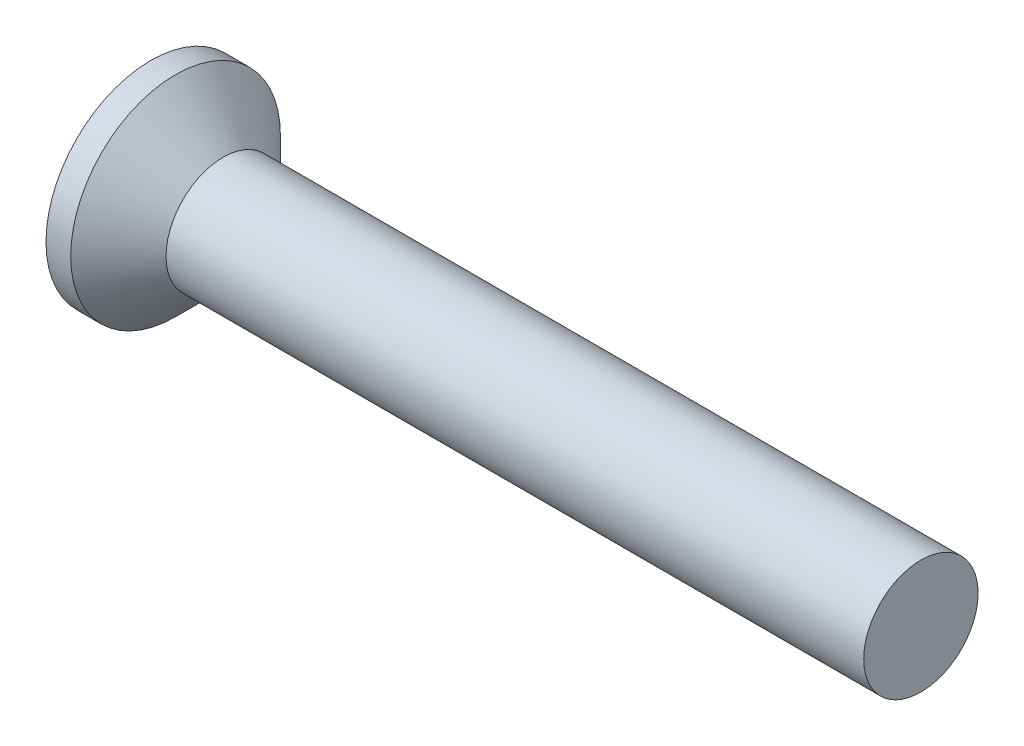
ISO-10303-21;
HEADER;
FILE_DESCRIPTION(('STEP AP214'),'2;1');
FILE_NAME('part.step','',(''),(''),'','','');
FILE_SCHEMA(('AUTOMOTIVE_DESIGN { 1 0 10303 214 1 1 1 1 }'));
ENDSEC;
DATA;
#1=APPLICATION_CONTEXT('core data for automotive mechanical design processes');
#2=APPLICATION_PROTOCOL_DEFINITION('international standard','automotive_design',2000,#1);
#3=PRODUCT_CONTEXT('',#1,'mechanical');
#4=PRODUCT('Part','Part','',(#3));
#5=PRODUCT_RELATED_PRODUCT_CATEGORY('part','',(#4));
#6=PRODUCT_DEFINITION_FORMATION('','',#4);
#7=PRODUCT_DEFINITION_CONTEXT('part definition',#1,'design');
#8=PRODUCT_DEFINITION('design','',#6,#7);
#9=PRODUCT_DEFINITION_SHAPE('','',#8);
#10=(LENGTH_UNIT() NAMED_UNIT(*) SI_UNIT(.MILLI.,.METRE.));
#11=(NAMED_UNIT(*) PLANE_ANGLE_UNIT() SI_UNIT($,.RADIAN.));
#12=(NAMED_UNIT(*) SI_UNIT($,.STERADIAN.) SOLID_ANGLE_UNIT());
#13=UNCERTAINTY_MEASURE_WITH_UNIT(LENGTH_MEASURE(1.E-05),#10,'distance_accuracy_value','');
#14=(GEOMETRIC_REPRESENTATION_CONTEXT(3) GLOBAL_UNCERTAINTY_ASSIGNED_CONTEXT((#13)) GLOBAL_UNIT_ASSIGNED_CONTEXT((#10,
#11,#12)) REPRESENTATION_CONTEXT('',''));
#15=CARTESIAN_POINT('',(0.,0.,0.));
#16=DIRECTION('',(0.,0.,1.));
#17=DIRECTION('',(1.,0.,0.));
#18=AXIS2_PLACEMENT_3D('',#15,#16,#17);
#19=CARTESIAN_POINT('',(7.4,0.,0.));
#20=DIRECTION('',(-1.,0.,0.));
#21=DIRECTION('',(0.,-1.,0.));
#22=AXIS2_PLACEMENT_3D('',#19,#20,#21);
#23=SPHERICAL_SURFACE('',#22,7.4);
#24=CARTESIAN_POINT('',(0.529956332016513,0.,0.));
#25=DIRECTION('',(-1.,0.,0.));
#26=DIRECTION('',(0.,0.,1.));
#27=AXIS2_PLACEMENT_3D('',#24,#25,#26);
#28=CIRCLE('',#27,2.75);
#29=CARTESIAN_POINT('',(0.529956332016513,0.,2.75));
#30=VERTEX_POINT('',#29);
#31=EDGE_CURVE('E159',#30,#30,#28,.T.);
#32=ORIENTED_EDGE('',*,*,#31,.T.);
#33=EDGE_LOOP('',(#32));
#34=FACE_BOUND('',#33,.T.);
#35=CARTESIAN_POINT('',(7.37844022875731,0.,-0.24209285299019));
#36=DIRECTION('',(-0.0887047329662643,0.,-0.996057965356125));
#37=DIRECTION('',(-0.996057965356125,0.,0.0887047329662643));
#38=AXIS2_PLACEMENT_3D('',#35,#36,#37);
#39=CIRCLE('',#38,7.39600745178066);
#40=CARTESIAN_POINT('',(0.185890101969758,1.59933099603895,0.398445409373938));
#41=VERTEX_POINT('',#40);
#42=CARTESIAN_POINT('',(0.0230796751196933,0.41294462120715,0.412944621207152));
#43=VERTEX_POINT('',#42);
#44=EDGE_CURVE('E127',#41,#43,#39,.F.);
#45=ORIENTED_EDGE('',*,*,#44,.T.);
#46=CARTESIAN_POINT('',(7.37844022875731,-0.24209285299019,0.));
#47=DIRECTION('',(-0.0887047329662644,-0.996057965356125,0.));
#48=DIRECTION('',(0.996057965356125,-0.0887047329662644,0.));
#49=AXIS2_PLACEMENT_3D('',#46,#47,#48);
#50=CIRCLE('',#49,7.39600745178066);
#51=CARTESIAN_POINT('',(0.185890101969758,0.398445409373932,1.59933099603895));
#52=VERTEX_POINT('',#51);
#53=EDGE_CURVE('E109',#43,#52,#50,.F.);
#54=ORIENTED_EDGE('',*,*,#53,.T.);
#55=CARTESIAN_POINT('',(5.99170841267437,0.,-2.16946737088841));
#56=DIRECTION('',(0.544482116778557,0.,0.838772450971264));
#57=DIRECTION('',(0.838772450971265,0.,-0.544482116778557));
#58=AXIS2_PLACEMENT_3D('',#55,#56,#57);
#59=CIRCLE('',#58,6.93326230080172);
#60=CARTESIAN_POINT('',(0.185890101969758,-0.398445409373944,1.59933099603894));
#61=VERTEX_POINT('',#60);
#62=EDGE_CURVE('E120',#61,#52,#59,.F.);
#63=ORIENTED_EDGE('',*,*,#62,.F.);
#64=CARTESIAN_POINT('',(7.37844022875731,0.24209285299019,0.));
#65=DIRECTION('',(-0.0887047329662643,0.996057965356125,0.));
#66=DIRECTION('',(-0.996057965356125,-0.0887047329662643,0.));
#67=AXIS2_PLACEMENT_3D('',#64,#65,#66);
#68=CIRCLE('',#67,7.39600745178066);
#69=CARTESIAN_POINT('',(0.0230796751196933,-0.412944621207153,0.412944621207152));
#70=VERTEX_POINT('',#69);
#71=EDGE_CURVE('E189',#61,#70,#68,.F.);
#72=ORIENTED_EDGE('',*,*,#71,.T.);
#73=CARTESIAN_POINT('',(0.185890101969758,-1.59933099603894,0.398445409373938));
#74=VERTEX_POINT('',#73);
#75=EDGE_CURVE('E164',#70,#74,#39,.F.);
#76=ORIENTED_EDGE('',*,*,#75,.T.);
#77=CARTESIAN_POINT('',(5.99170841267437,2.16946737088841,0.));
#78=DIRECTION('',(0.544482116778557,-0.838772450971264,0.));
#79=DIRECTION('',(0.838772450971264,0.544482116778557,0.));
#80=AXIS2_PLACEMENT_3D('',#77,#78,#79);
#81=CIRCLE('',#80,6.93326230080172);
#82=CARTESIAN_POINT('',(0.185890101969758,-1.59933099603895,-0.398445409373938));
#83=VERTEX_POINT('',#82);
#84=EDGE_CURVE('E162',#83,#74,#81,.F.);
#85=ORIENTED_EDGE('',*,*,#84,.F.);
#86=CARTESIAN_POINT('',(7.37844022875731,0.,0.24209285299019));
#87=DIRECTION('',(-0.0887047329662644,0.,0.996057965356125));
#88=DIRECTION('',(0.996057965356125,0.,0.0887047329662644));
#89=AXIS2_PLACEMENT_3D('',#86,#87,#88);
#90=CIRCLE('',#89,7.39600745178066);
#91=CARTESIAN_POINT('',(0.0230796751196933,-0.41294462120715,-0.412944621207152));
#92=VERTEX_POINT('',#91);
#93=EDGE_CURVE('E166',#83,#92,#90,.F.);
#94=ORIENTED_EDGE('',*,*,#93,.T.);
#95=CARTESIAN_POINT('',(0.185890101969758,-0.398445409373932,-1.59933099603895));
#96=VERTEX_POINT('',#95);
#97=EDGE_CURVE('E193',#92,#96,#68,.F.);
#98=ORIENTED_EDGE('',*,*,#97,.T.);
#99=CARTESIAN_POINT('',(5.99170841267437,0.,2.16946737088841));
#100=DIRECTION('',(0.544482116778557,0.,-0.838772450971264));
#101=DIRECTION('',(-0.838772450971264,0.,-0.544482116778557));
#102=AXIS2_PLACEMENT_3D('',#99,#100,#101);
#103=CIRCLE('',#102,6.93326230080172);
#104=CARTESIAN_POINT('',(0.185890101969758,0.398445409373943,-1.59933099603894));
#105=VERTEX_POINT('',#104);
#106=EDGE_CURVE('E121',#105,#96,#103,.F.);
#107=ORIENTED_EDGE('',*,*,#106,.F.);
#108=CARTESIAN_POINT('',(0.0230796751196933,0.412944621207153,-0.412944621207152));
#109=VERTEX_POINT('',#108);
#110=EDGE_CURVE('E146',#105,#109,#50,.F.);
#111=ORIENTED_EDGE('',*,*,#110,.T.);
#112=CARTESIAN_POINT('',(0.185890101969758,1.59933099603895,-0.398445409373938));
#113=VERTEX_POINT('',#112);
#114=EDGE_CURVE('E60',#109,#113,#90,.F.);
#115=ORIENTED_EDGE('',*,*,#114,.T.);
#116=CARTESIAN_POINT('',(5.99170841267437,-2.1694673708884,0.));
#117=DIRECTION('',(0.544482116778557,0.838772450971264,0.));
#118=DIRECTION('',(-0.838772450971265,0.544482116778557,0.));
#119=AXIS2_PLACEMENT_3D('',#116,#117,#118);
#120=CIRCLE('',#119,6.93326230080172);
#121=EDGE_CURVE('E45',#41,#113,#120,.F.);
#122=ORIENTED_EDGE('',*,*,#121,.F.);
#123=EDGE_LOOP('',(#45,#54,#63,#72,#76,#85,#94,#98,#107,#111,#115,#122));
#124=FACE_BOUND('',#123,.T.);
#125=ADVANCED_FACE('F37',(#34,#124),#23,.T.);
#126=CARTESIAN_POINT('',(2.64965289256198,0.,-0.17903305785124));
#127=DIRECTION('',(-0.0887047329662644,0.,0.996057965356125));
#128=DIRECTION('',(0.996057965356125,0.,0.0887047329662644));
#129=AXIS2_PLACEMENT_3D('',#126,#127,#128);
#130=PLANE('',#129);
#131=ORIENTED_EDGE('',*,*,#114,.F.);
#132=DIRECTION('',(0.992162185069946,-0.0883577911596629,0.0883577911596626));
#133=VECTOR('',#132,1.);
#134=CARTESIAN_POINT('',(2.66534787197402,0.177635328998022,-0.177635328998022));
#135=LINE('',#134,#133);
#136=CARTESIAN_POINT('',(2.33,0.207500000000001,-0.207499999999999));
#137=VERTEX_POINT('',#136);
#138=EDGE_CURVE('E171',#109,#137,#135,.T.);
#139=ORIENTED_EDGE('',*,*,#138,.T.);
#140=DIRECTION('',(0.836442139156631,-0.542969414366697,0.0744900188304725));
#141=VECTOR('',#140,1.);
#142=CARTESIAN_POINT('',(0.,1.72,-0.415));
#143=LINE('',#142,#141);
#144=EDGE_CURVE('E130',#113,#137,#143,.T.);
#145=ORIENTED_EDGE('',*,*,#144,.F.);
#146=EDGE_LOOP('',(#131,#139,#145));
#147=FACE_BOUND('',#146,.T.);
#148=ADVANCED_FACE('F170',(#147),#130,.T.);
#149=DIRECTION('',(0.836442139156631,0.542969414366697,0.0744900188304725));
#150=VECTOR('',#149,1.);
#151=CARTESIAN_POINT('',(0.,-1.72,-0.415));
#152=LINE('',#151,#150);
#153=CARTESIAN_POINT('',(2.33,-0.2075,-0.2075));
#154=VERTEX_POINT('',#153);
#155=EDGE_CURVE('E52',#83,#154,#152,.T.);
#156=ORIENTED_EDGE('',*,*,#155,.T.);
#157=DIRECTION('',(-0.992162185069946,-0.0883577911596623,-0.0883577911596626));
#158=VECTOR('',#157,1.);
#159=CARTESIAN_POINT('',(2.66534787197402,-0.177635328998021,-0.177635328998022));
#160=LINE('',#159,#158);
#161=EDGE_CURVE('E191',#154,#92,#160,.T.);
#162=ORIENTED_EDGE('',*,*,#161,.T.);
#163=ORIENTED_EDGE('',*,*,#93,.F.);
#164=EDGE_LOOP('',(#156,#162,#163));
#165=FACE_BOUND('',#164,.T.);
#166=ADVANCED_FACE('F215',(#165),#130,.T.);
#167=CARTESIAN_POINT('',(2.64965289256198,0.,0.17903305785124));
#168=DIRECTION('',(-0.0887047329662643,0.,-0.996057965356125));
#169=DIRECTION('',(-0.996057965356125,0.,0.0887047329662643));
#170=AXIS2_PLACEMENT_3D('',#167,#168,#169);
#171=PLANE('',#170);
#172=DIRECTION('',(0.836442139156631,-0.542969414366697,-0.0744900188304726));
#173=VECTOR('',#172,1.);
#174=CARTESIAN_POINT('',(0.,1.72,0.415));
#175=LINE('',#174,#173);
#176=CARTESIAN_POINT('',(2.33,0.207499999999999,0.207500000000001));
#177=VERTEX_POINT('',#176);
#178=EDGE_CURVE('E125',#41,#177,#175,.T.);
#179=ORIENTED_EDGE('',*,*,#178,.T.);
#180=DIRECTION('',(-0.992162185069946,0.0883577911596623,0.0883577911596626));
#181=VECTOR('',#180,1.);
#182=CARTESIAN_POINT('',(2.66534787197402,0.177635328998021,0.177635328998022));
#183=LINE('',#182,#181);
#184=EDGE_CURVE('E11',#177,#43,#183,.T.);
#185=ORIENTED_EDGE('',*,*,#184,.T.);
#186=ORIENTED_EDGE('',*,*,#44,.F.);
#187=EDGE_LOOP('',(#179,#185,#186));
#188=FACE_BOUND('',#187,.T.);
#189=ADVANCED_FACE('F126',(#188),#171,.T.);
#190=ORIENTED_EDGE('',*,*,#75,.F.);
#191=DIRECTION('',(0.992162185069946,0.0883577911596629,-0.0883577911596626));
#192=VECTOR('',#191,1.);
#193=CARTESIAN_POINT('',(2.66534787197402,-0.177635328998022,0.177635328998022));
#194=LINE('',#193,#192);
#195=CARTESIAN_POINT('',(2.33,-0.2075,0.2075));
#196=VERTEX_POINT('',#195);
#197=EDGE_CURVE('E186',#70,#196,#194,.T.);
#198=ORIENTED_EDGE('',*,*,#197,.T.);
#199=DIRECTION('',(0.836442139156631,0.542969414366697,-0.0744900188304724));
#200=VECTOR('',#199,1.);
#201=CARTESIAN_POINT('',(0.,-1.72,0.415));
#202=LINE('',#201,#200);
#203=EDGE_CURVE('E177',#74,#196,#202,.T.);
#204=ORIENTED_EDGE('',*,*,#203,.F.);
#205=EDGE_LOOP('',(#190,#198,#204));
#206=FACE_BOUND('',#205,.T.);
#207=ADVANCED_FACE('F185',(#206),#171,.T.);
#208=CARTESIAN_POINT('',(20.7276690729551,0.,0.));
#209=DIRECTION('',(-1.,0.,0.));
#210=DIRECTION('',(0.,0.,1.));
#211=AXIS2_PLACEMENT_3D('',#208,#209,#210);
#212=PLANE('',#211);
#213=CARTESIAN_POINT('',(20.7276690729551,0.,0.));
#214=DIRECTION('',(-1.,0.,0.));
#215=DIRECTION('',(0.,0.,1.));
#216=AXIS2_PLACEMENT_3D('',#213,#214,#215);
#217=CIRCLE('',#216,1.5);
#218=CARTESIAN_POINT('',(20.7276690729551,0.,1.5));
#219=VERTEX_POINT('',#218);
#220=EDGE_CURVE('E150',#219,#219,#217,.T.);
#221=ORIENTED_EDGE('',*,*,#220,.F.);
#222=EDGE_LOOP('',(#221));
#223=FACE_BOUND('',#222,.T.);
#224=ADVANCED_FACE('F39',(#223),#212,.F.);
#225=CARTESIAN_POINT('',(-15.875,0.,0.));
#226=DIRECTION('',(-1.,0.,0.));
#227=DIRECTION('',(0.,0.,1.));
#228=AXIS2_PLACEMENT_3D('',#225,#226,#227);
#229=CYLINDRICAL_SURFACE('',#228,2.75);
#230=ORIENTED_EDGE('',*,*,#31,.F.);
#231=EDGE_LOOP('',(#230));
#232=FACE_BOUND('',#231,.T.);
#233=CARTESIAN_POINT('',(1.1776690729551,0.,0.));
#234=DIRECTION('',(-1.,0.,0.));
#235=DIRECTION('',(0.,0.,1.));
#236=AXIS2_PLACEMENT_3D('',#233,#234,#235);
#237=CIRCLE('',#236,2.75);
#238=CARTESIAN_POINT('',(1.1776690729551,0.,2.75));
#239=VERTEX_POINT('',#238);
#240=EDGE_CURVE('E156',#239,#239,#237,.T.);
#241=ORIENTED_EDGE('',*,*,#240,.T.);
#242=EDGE_LOOP('',(#241));
#243=FACE_BOUND('',#242,.T.);
#244=ADVANCED_FACE('F234',(#232,#243),#229,.T.);
#245=CARTESIAN_POINT('',(2.42766907295509,0.,0.));
#246=DIRECTION('',(-1.,0.,0.));
#247=DIRECTION('',(0.,0.,1.));
#248=AXIS2_PLACEMENT_3D('',#245,#246,#247);
#249=CONICAL_SURFACE('',#248,1.5,0.785398163397449);
#250=ORIENTED_EDGE('',*,*,#240,.F.);
#251=EDGE_LOOP('',(#250));
#252=FACE_BOUND('',#251,.T.);
#253=CARTESIAN_POINT('',(2.42766907295509,0.,0.));
#254=DIRECTION('',(-1.,0.,0.));
#255=DIRECTION('',(0.,0.,1.));
#256=AXIS2_PLACEMENT_3D('',#253,#254,#255);
#257=CIRCLE('',#256,1.5);
#258=CARTESIAN_POINT('',(2.42766907295509,0.,1.5));
#259=VERTEX_POINT('',#258);
#260=EDGE_CURVE('E153',#259,#259,#257,.T.);
#261=ORIENTED_EDGE('',*,*,#260,.T.);
#262=EDGE_LOOP('',(#261));
#263=FACE_BOUND('',#262,.T.);
#264=ADVANCED_FACE('F237',(#252,#263),#249,.T.);
#265=CARTESIAN_POINT('',(-15.875,0.,0.));
#266=DIRECTION('',(-1.,0.,0.));
#267=DIRECTION('',(0.,0.,1.));
#268=AXIS2_PLACEMENT_3D('',#265,#266,#267);
#269=CYLINDRICAL_SURFACE('',#268,1.5);
#270=ORIENTED_EDGE('',*,*,#260,.F.);
#271=EDGE_LOOP('',(#270));
#272=FACE_BOUND('',#271,.T.);
#273=ORIENTED_EDGE('',*,*,#220,.T.);
#274=EDGE_LOOP('',(#273));
#275=FACE_BOUND('',#274,.T.);
#276=ADVANCED_FACE('F241',(#272,#275),#269,.T.);
#277=CARTESIAN_POINT('',(2.33,0.2075,-0.2075));
#278=DIRECTION('',(-1.,0.,0.));
#279=DIRECTION('',(0.,0.,1.));
#280=AXIS2_PLACEMENT_3D('',#277,#278,#279);
#281=PLANE('',#280);
#282=DIRECTION('',(0.,1.,0.));
#283=VECTOR('',#282,1.);
#284=CARTESIAN_POINT('',(2.33,-0.2075,-0.2075));
#285=LINE('',#284,#283);
#286=EDGE_CURVE('E143',#154,#137,#285,.T.);
#287=ORIENTED_EDGE('',*,*,#286,.F.);
#288=DIRECTION('',(0.,0.,1.));
#289=VECTOR('',#288,1.);
#290=CARTESIAN_POINT('',(2.33,-0.2075,-0.2075));
#291=LINE('',#290,#289);
#292=EDGE_CURVE('E138',#154,#196,#291,.T.);
#293=ORIENTED_EDGE('',*,*,#292,.T.);
#294=DIRECTION('',(0.,-1.,0.));
#295=VECTOR('',#294,1.);
#296=CARTESIAN_POINT('',(2.33,0.2075,0.2075));
#297=LINE('',#296,#295);
#298=EDGE_CURVE('E117',#177,#196,#297,.T.);
#299=ORIENTED_EDGE('',*,*,#298,.F.);
#300=DIRECTION('',(0.,0.,-1.));
#301=VECTOR('',#300,1.);
#302=CARTESIAN_POINT('',(2.33,0.2075,0.2075));
#303=LINE('',#302,#301);
#304=EDGE_CURVE('E137',#177,#137,#303,.T.);
#305=ORIENTED_EDGE('',*,*,#304,.T.);
#306=EDGE_LOOP('',(#287,#293,#299,#305));
#307=FACE_BOUND('',#306,.T.);
#308=ADVANCED_FACE('F136',(#307),#281,.T.);
#309=CARTESIAN_POINT('',(2.33,0.2075,0.2075));
#310=DIRECTION('',(0.544482116778557,0.838772450971264,0.));
#311=DIRECTION('',(-0.838772450971265,0.544482116778557,0.));
#312=AXIS2_PLACEMENT_3D('',#309,#310,#311);
#313=PLANE('',#312);
#314=ORIENTED_EDGE('',*,*,#121,.T.);
#315=ORIENTED_EDGE('',*,*,#144,.T.);
#316=ORIENTED_EDGE('',*,*,#304,.F.);
#317=ORIENTED_EDGE('',*,*,#178,.F.);
#318=EDGE_LOOP('',(#314,#315,#316,#317));
#319=FACE_BOUND('',#318,.T.);
#320=ADVANCED_FACE('F141',(#319),#313,.F.);
#321=CARTESIAN_POINT('',(2.33,-0.2075,-0.2075));
#322=DIRECTION('',(0.544482116778557,-0.838772450971264,0.));
#323=DIRECTION('',(0.838772450971264,0.544482116778557,0.));
#324=AXIS2_PLACEMENT_3D('',#321,#322,#323);
#325=PLANE('',#324);
#326=ORIENTED_EDGE('',*,*,#84,.T.);
#327=ORIENTED_EDGE('',*,*,#203,.T.);
#328=ORIENTED_EDGE('',*,*,#292,.F.);
#329=ORIENTED_EDGE('',*,*,#155,.F.);
#330=EDGE_LOOP('',(#326,#327,#328,#329));
#331=FACE_BOUND('',#330,.T.);
#332=ADVANCED_FACE('F180',(#331),#325,.F.);
#333=CARTESIAN_POINT('',(2.64965289256198,0.17903305785124,0.));
#334=DIRECTION('',(-0.0887047329662644,-0.996057965356125,0.));
#335=DIRECTION('',(0.996057965356125,-0.0887047329662644,0.));
#336=AXIS2_PLACEMENT_3D('',#333,#334,#335);
#337=PLANE('',#336);
#338=ORIENTED_EDGE('',*,*,#184,.F.);
#339=DIRECTION('',(0.836442139156631,-0.0744900188304706,-0.542969414366698));
#340=VECTOR('',#339,1.);
#341=CARTESIAN_POINT('',(0.,0.414999999999994,1.72));
#342=LINE('',#341,#340);
#343=EDGE_CURVE('E107',#52,#177,#342,.T.);
#344=ORIENTED_EDGE('',*,*,#343,.F.);
#345=ORIENTED_EDGE('',*,*,#53,.F.);
#346=EDGE_LOOP('',(#338,#344,#345));
#347=FACE_BOUND('',#346,.T.);
#348=ADVANCED_FACE('F106',(#347),#337,.T.);
#349=CARTESIAN_POINT('',(2.64965289256198,-0.17903305785124,0.));
#350=DIRECTION('',(-0.0887047329662643,0.996057965356125,0.));
#351=DIRECTION('',(-0.996057965356125,-0.0887047329662643,0.));
#352=AXIS2_PLACEMENT_3D('',#349,#350,#351);
#353=PLANE('',#352);
#354=DIRECTION('',(0.836442139156631,0.0744900188304745,-0.542969414366697));
#355=VECTOR('',#354,1.);
#356=CARTESIAN_POINT('',(0.,-0.415000000000006,1.72));
#357=LINE('',#356,#355);
#358=EDGE_CURVE('E122',#61,#196,#357,.T.);
#359=ORIENTED_EDGE('',*,*,#358,.T.);
#360=ORIENTED_EDGE('',*,*,#197,.F.);
#361=ORIENTED_EDGE('',*,*,#71,.F.);
#362=EDGE_LOOP('',(#359,#360,#361));
#363=FACE_BOUND('',#362,.T.);
#364=ADVANCED_FACE('F216',(#363),#353,.T.);
#365=CARTESIAN_POINT('',(2.33,-0.207500000000001,0.207499999999999));
#366=DIRECTION('',(0.544482116778557,0.,0.838772450971264));
#367=DIRECTION('',(-0.838772450971265,0.,0.544482116778557));
#368=AXIS2_PLACEMENT_3D('',#365,#366,#367);
#369=PLANE('',#368);
#370=ORIENTED_EDGE('',*,*,#62,.T.);
#371=ORIENTED_EDGE('',*,*,#343,.T.);
#372=ORIENTED_EDGE('',*,*,#298,.T.);
#373=ORIENTED_EDGE('',*,*,#358,.F.);
#374=EDGE_LOOP('',(#370,#371,#372,#373));
#375=FACE_BOUND('',#374,.T.);
#376=ADVANCED_FACE('F114',(#375),#369,.F.);
#377=DIRECTION('',(0.836442139156631,-0.0744900188304744,0.542969414366697));
#378=VECTOR('',#377,1.);
#379=CARTESIAN_POINT('',(0.,0.415000000000006,-1.72));
#380=LINE('',#379,#378);
#381=EDGE_CURVE('E204',#105,#137,#380,.T.);
#382=ORIENTED_EDGE('',*,*,#381,.T.);
#383=ORIENTED_EDGE('',*,*,#138,.F.);
#384=ORIENTED_EDGE('',*,*,#110,.F.);
#385=EDGE_LOOP('',(#382,#383,#384));
#386=FACE_BOUND('',#385,.T.);
#387=ADVANCED_FACE('F203',(#386),#337,.T.);
#388=ORIENTED_EDGE('',*,*,#161,.F.);
#389=DIRECTION('',(0.836442139156631,0.0744900188304705,0.542969414366698));
#390=VECTOR('',#389,1.);
#391=CARTESIAN_POINT('',(0.,-0.414999999999994,-1.72));
#392=LINE('',#391,#390);
#393=EDGE_CURVE('E208',#96,#154,#392,.T.);
#394=ORIENTED_EDGE('',*,*,#393,.F.);
#395=ORIENTED_EDGE('',*,*,#97,.F.);
#396=EDGE_LOOP('',(#388,#394,#395));
#397=FACE_BOUND('',#396,.T.);
#398=ADVANCED_FACE('F213',(#397),#353,.T.);
#399=CARTESIAN_POINT('',(2.33,0.207500000000001,-0.207499999999999));
#400=DIRECTION('',(0.544482116778557,0.,-0.838772450971264));
#401=DIRECTION('',(0.838772450971264,0.,0.544482116778557));
#402=AXIS2_PLACEMENT_3D('',#399,#400,#401);
#403=PLANE('',#402);
#404=ORIENTED_EDGE('',*,*,#106,.T.);
#405=ORIENTED_EDGE('',*,*,#393,.T.);
#406=ORIENTED_EDGE('',*,*,#286,.T.);
#407=ORIENTED_EDGE('',*,*,#381,.F.);
#408=EDGE_LOOP('',(#404,#405,#406,#407));
#409=FACE_BOUND('',#408,.T.);
#410=ADVANCED_FACE('F206',(#409),#403,.F.);
#411=CLOSED_SHELL('',(#125,#148,#166,#189,#207,#224,#244,#264,#276,#308,#320,#332,#348,#364,
#376,#387,#398,#410));
#412=MANIFOLD_SOLID_BREP('B2',#411);
#413=ADVANCED_BREP_SHAPE_REPRESENTATION('',(#18,#412),#14);
#414=SHAPE_DEFINITION_REPRESENTATION(#9,#413);
ENDSEC;
END-ISO-10303-21;
